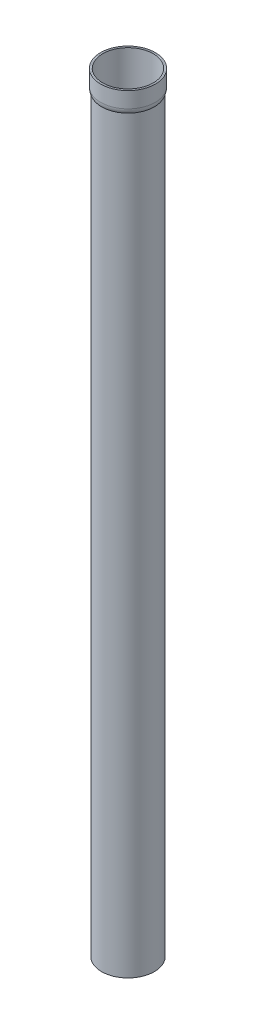
ISO-10303-21;
HEADER;
FILE_DESCRIPTION(('STEP AP214'),'2;1');
FILE_NAME('part.step','',(''),(''),'','','');
FILE_SCHEMA(('AUTOMOTIVE_DESIGN { 1 0 10303 214 1 1 1 1 }'));
ENDSEC;
DATA;
#1=APPLICATION_CONTEXT('core data for automotive mechanical design processes');
#2=APPLICATION_PROTOCOL_DEFINITION('international standard','automotive_design',2000,#1);
#3=PRODUCT_CONTEXT('',#1,'mechanical');
#4=PRODUCT('Part','Part','',(#3));
#5=PRODUCT_RELATED_PRODUCT_CATEGORY('part','',(#4));
#6=PRODUCT_DEFINITION_FORMATION('','',#4);
#7=PRODUCT_DEFINITION_CONTEXT('part definition',#1,'design');
#8=PRODUCT_DEFINITION('design','',#6,#7);
#9=PRODUCT_DEFINITION_SHAPE('','',#8);
#10=(LENGTH_UNIT() NAMED_UNIT(*) SI_UNIT(.MILLI.,.METRE.));
#11=(NAMED_UNIT(*) PLANE_ANGLE_UNIT() SI_UNIT($,.RADIAN.));
#12=(NAMED_UNIT(*) SI_UNIT($,.STERADIAN.) SOLID_ANGLE_UNIT());
#13=UNCERTAINTY_MEASURE_WITH_UNIT(LENGTH_MEASURE(1.E-05),#10,'distance_accuracy_value','');
#14=(GEOMETRIC_REPRESENTATION_CONTEXT(3) GLOBAL_UNCERTAINTY_ASSIGNED_CONTEXT((#13)) GLOBAL_UNIT_ASSIGNED_CONTEXT((#10,
#11,#12)) REPRESENTATION_CONTEXT('',''));
#15=CARTESIAN_POINT('',(0.,0.,0.));
#16=DIRECTION('',(0.,0.,1.));
#17=DIRECTION('',(1.,0.,0.));
#18=AXIS2_PLACEMENT_3D('',#15,#16,#17);
#19=CARTESIAN_POINT('',(0.,740.,0.));
#20=DIRECTION('',(0.,1.,0.));
#21=DIRECTION('',(0.,0.,1.));
#22=AXIS2_PLACEMENT_3D('',#19,#20,#21);
#23=CYLINDRICAL_SURFACE('',#22,27.);
#24=CARTESIAN_POINT('',(0.,744.358898943541,0.));
#25=DIRECTION('',(0.,-1.,0.));
#26=DIRECTION('',(0.,0.,-1.));
#27=AXIS2_PLACEMENT_3D('',#24,#25,#26);
#28=CIRCLE('',#27,27.);
#29=CARTESIAN_POINT('',(0.,744.358898943541,-27.));
#30=VERTEX_POINT('',#29);
#31=EDGE_CURVE('E12',#30,#30,#28,.F.);
#32=ORIENTED_EDGE('',*,*,#31,.T.);
#33=EDGE_LOOP('',(#32));
#34=FACE_BOUND('',#33,.T.);
#35=CARTESIAN_POINT('',(0.,760.,0.));
#36=DIRECTION('',(0.,1.,0.));
#37=DIRECTION('',(0.,0.,1.));
#38=AXIS2_PLACEMENT_3D('',#35,#36,#37);
#39=CIRCLE('',#38,27.);
#40=CARTESIAN_POINT('',(0.,760.,27.));
#41=VERTEX_POINT('',#40);
#42=EDGE_CURVE('E58',#41,#41,#39,.T.);
#43=ORIENTED_EDGE('',*,*,#42,.F.);
#44=EDGE_LOOP('',(#43));
#45=FACE_BOUND('',#44,.T.);
#46=ADVANCED_FACE('F51',(#34,#45),#23,.T.);
#47=CARTESIAN_POINT('',(0.,760.,0.));
#48=DIRECTION('',(0.,1.,0.));
#49=DIRECTION('',(0.,0.,1.));
#50=AXIS2_PLACEMENT_3D('',#47,#48,#49);
#51=PLANE('',#50);
#52=CARTESIAN_POINT('',(0.,760.,0.));
#53=DIRECTION('',(0.,1.,0.));
#54=DIRECTION('',(0.,0.,1.));
#55=AXIS2_PLACEMENT_3D('',#52,#53,#54);
#56=CIRCLE('',#55,26.);
#57=CARTESIAN_POINT('',(0.,760.,26.));
#58=VERTEX_POINT('',#57);
#59=EDGE_CURVE('E66',#58,#58,#56,.T.);
#60=ORIENTED_EDGE('',*,*,#59,.F.);
#61=EDGE_LOOP('',(#60));
#62=FACE_BOUND('',#61,.T.);
#63=ORIENTED_EDGE('',*,*,#42,.T.);
#64=EDGE_LOOP('',(#63));
#65=FACE_BOUND('',#64,.T.);
#66=ADVANCED_FACE('F74',(#62,#65),#51,.T.);
#67=CARTESIAN_POINT('',(0.,740.,0.));
#68=DIRECTION('',(0.,1.,0.));
#69=DIRECTION('',(0.,0.,1.));
#70=AXIS2_PLACEMENT_3D('',#67,#68,#69);
#71=CYLINDRICAL_SURFACE('',#70,26.);
#72=CARTESIAN_POINT('',(0.,740.,0.));
#73=DIRECTION('',(0.,1.,0.));
#74=DIRECTION('',(0.,0.,1.));
#75=AXIS2_PLACEMENT_3D('',#72,#73,#74);
#76=CIRCLE('',#75,26.);
#77=CARTESIAN_POINT('',(0.,740.,26.));
#78=VERTEX_POINT('',#77);
#79=EDGE_CURVE('E62',#78,#78,#76,.T.);
#80=ORIENTED_EDGE('',*,*,#79,.F.);
#81=EDGE_LOOP('',(#80));
#82=FACE_BOUND('',#81,.T.);
#83=ORIENTED_EDGE('',*,*,#59,.T.);
#84=EDGE_LOOP('',(#83));
#85=FACE_BOUND('',#84,.T.);
#86=ADVANCED_FACE('F72',(#82,#85),#71,.F.);
#87=CARTESIAN_POINT('',(0.,744.358898943541,0.));
#88=DIRECTION('',(0.,-1.,0.));
#89=DIRECTION('',(0.,0.,-1.));
#90=AXIS2_PLACEMENT_3D('',#87,#88,#89);
#91=TOROIDAL_SURFACE('',#90,17.,10.);
#92=ORIENTED_EDGE('',*,*,#79,.T.);
#93=EDGE_LOOP('',(#92));
#94=FACE_BOUND('',#93,.T.);
#95=ORIENTED_EDGE('',*,*,#31,.F.);
#96=EDGE_LOOP('',(#95));
#97=FACE_BOUND('',#96,.T.);
#98=ADVANCED_FACE('F53',(#94,#97),#91,.T.);
#99=CLOSED_SHELL('',(#46,#66,#86,#98));
#100=MANIFOLD_SOLID_BREP('B2',#99);
#101=CARTESIAN_POINT('',(0.,760.,0.));
#102=DIRECTION('',(0.,1.,0.));
#103=DIRECTION('',(0.,0.,1.));
#104=AXIS2_PLACEMENT_3D('',#101,#102,#103);
#105=PLANE('',#104);
#106=CARTESIAN_POINT('',(0.,760.,0.));
#107=DIRECTION('',(0.,1.,0.));
#108=DIRECTION('',(0.,0.,1.));
#109=AXIS2_PLACEMENT_3D('',#106,#107,#108);
#110=CIRCLE('',#109,26.);
#111=CARTESIAN_POINT('',(0.,760.,26.));
#112=VERTEX_POINT('',#111);
#113=EDGE_CURVE('E50',#112,#112,#110,.T.);
#114=ORIENTED_EDGE('',*,*,#113,.T.);
#115=EDGE_LOOP('',(#114));
#116=FACE_BOUND('',#115,.T.);
#117=CARTESIAN_POINT('',(0.,760.,0.));
#118=DIRECTION('',(0.,1.,0.));
#119=DIRECTION('',(0.,0.,1.));
#120=AXIS2_PLACEMENT_3D('',#117,#118,#119);
#121=CIRCLE('',#120,25.);
#122=CARTESIAN_POINT('',(0.,760.,25.));
#123=VERTEX_POINT('',#122);
#124=EDGE_CURVE('E123',#123,#123,#121,.T.);
#125=ORIENTED_EDGE('',*,*,#124,.F.);
#126=EDGE_LOOP('',(#125));
#127=FACE_BOUND('',#126,.T.);
#128=ADVANCED_FACE('F112',(#116,#127),#105,.T.);
#129=CARTESIAN_POINT('',(0.,0.,0.));
#130=DIRECTION('',(0.,1.,0.));
#131=DIRECTION('',(0.,0.,1.));
#132=AXIS2_PLACEMENT_3D('',#129,#130,#131);
#133=PLANE('',#132);
#134=CARTESIAN_POINT('',(0.,0.,0.));
#135=DIRECTION('',(0.,1.,0.));
#136=DIRECTION('',(0.,0.,1.));
#137=AXIS2_PLACEMENT_3D('',#134,#135,#136);
#138=CIRCLE('',#137,26.);
#139=CARTESIAN_POINT('',(0.,0.,26.));
#140=VERTEX_POINT('',#139);
#141=EDGE_CURVE('E116',#140,#140,#138,.T.);
#142=ORIENTED_EDGE('',*,*,#141,.F.);
#143=EDGE_LOOP('',(#142));
#144=FACE_BOUND('',#143,.T.);
#145=CARTESIAN_POINT('',(0.,0.,0.));
#146=DIRECTION('',(0.,1.,0.));
#147=DIRECTION('',(0.,0.,1.));
#148=AXIS2_PLACEMENT_3D('',#145,#146,#147);
#149=CIRCLE('',#148,25.);
#150=CARTESIAN_POINT('',(0.,0.,25.));
#151=VERTEX_POINT('',#150);
#152=EDGE_CURVE('E125',#151,#151,#149,.T.);
#153=ORIENTED_EDGE('',*,*,#152,.T.);
#154=EDGE_LOOP('',(#153));
#155=FACE_BOUND('',#154,.T.);
#156=ADVANCED_FACE('F135',(#144,#155),#133,.F.);
#157=CARTESIAN_POINT('',(0.,760.,0.));
#158=DIRECTION('',(0.,-1.,0.));
#159=DIRECTION('',(0.,0.,-1.));
#160=AXIS2_PLACEMENT_3D('',#157,#158,#159);
#161=CYLINDRICAL_SURFACE('',#160,26.);
#162=ORIENTED_EDGE('',*,*,#113,.F.);
#163=EDGE_LOOP('',(#162));
#164=FACE_BOUND('',#163,.T.);
#165=ORIENTED_EDGE('',*,*,#141,.T.);
#166=EDGE_LOOP('',(#165));
#167=FACE_BOUND('',#166,.T.);
#168=ADVANCED_FACE('F114',(#164,#167),#161,.T.);
#169=CARTESIAN_POINT('',(0.,760.,0.));
#170=DIRECTION('',(0.,-1.,0.));
#171=DIRECTION('',(0.,0.,-1.));
#172=AXIS2_PLACEMENT_3D('',#169,#170,#171);
#173=CYLINDRICAL_SURFACE('',#172,25.);
#174=ORIENTED_EDGE('',*,*,#124,.T.);
#175=EDGE_LOOP('',(#174));
#176=FACE_BOUND('',#175,.T.);
#177=ORIENTED_EDGE('',*,*,#152,.F.);
#178=EDGE_LOOP('',(#177));
#179=FACE_BOUND('',#178,.T.);
#180=ADVANCED_FACE('F131',(#176,#179),#173,.F.);
#181=CLOSED_SHELL('',(#128,#156,#168,#180));
#182=MANIFOLD_SOLID_BREP('B7',#181);
#183=ADVANCED_BREP_SHAPE_REPRESENTATION('',(#18,#100,#182),#14);
#184=SHAPE_DEFINITION_REPRESENTATION(#9,#183);
ENDSEC;
END-ISO-10303-21;
